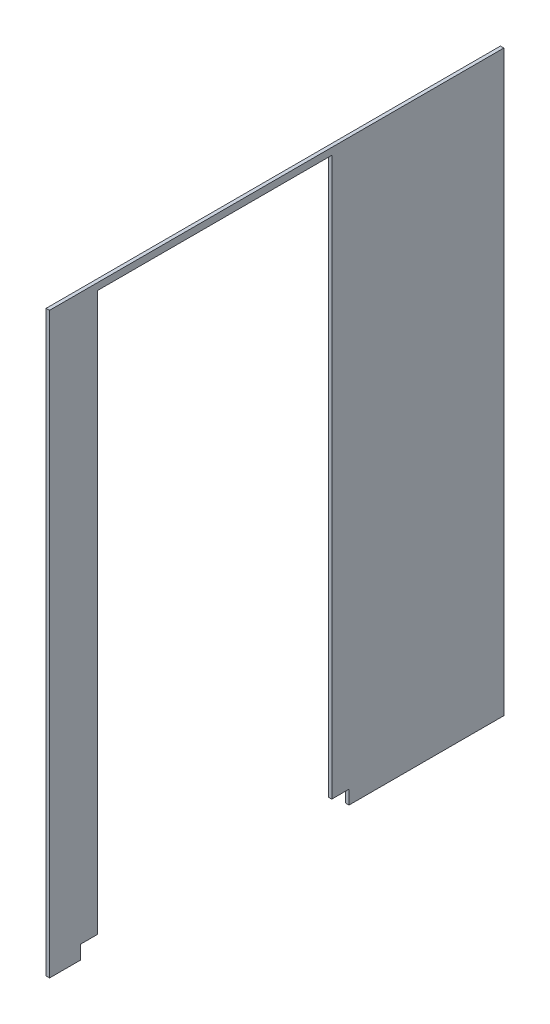
ISO-10303-21;
HEADER;
FILE_DESCRIPTION(('STEP AP214'),'2;1');
FILE_NAME('part.step','',(''),(''),'','','');
FILE_SCHEMA(('AUTOMOTIVE_DESIGN { 1 0 10303 214 1 1 1 1 }'));
ENDSEC;
DATA;
#1=APPLICATION_CONTEXT('core data for automotive mechanical design processes');
#2=APPLICATION_PROTOCOL_DEFINITION('international standard','automotive_design',2000,#1);
#3=PRODUCT_CONTEXT('',#1,'mechanical');
#4=PRODUCT('Part','Part','',(#3));
#5=PRODUCT_RELATED_PRODUCT_CATEGORY('part','',(#4));
#6=PRODUCT_DEFINITION_FORMATION('','',#4);
#7=PRODUCT_DEFINITION_CONTEXT('part definition',#1,'design');
#8=PRODUCT_DEFINITION('design','',#6,#7);
#9=PRODUCT_DEFINITION_SHAPE('','',#8);
#10=(LENGTH_UNIT() NAMED_UNIT(*) SI_UNIT(.MILLI.,.METRE.));
#11=(NAMED_UNIT(*) PLANE_ANGLE_UNIT() SI_UNIT($,.RADIAN.));
#12=(NAMED_UNIT(*) SI_UNIT($,.STERADIAN.) SOLID_ANGLE_UNIT());
#13=UNCERTAINTY_MEASURE_WITH_UNIT(LENGTH_MEASURE(1.E-05),#10,'distance_accuracy_value','');
#14=(GEOMETRIC_REPRESENTATION_CONTEXT(3) GLOBAL_UNCERTAINTY_ASSIGNED_CONTEXT((#13)) GLOBAL_UNIT_ASSIGNED_CONTEXT((#10,
#11,#12)) REPRESENTATION_CONTEXT('',''));
#15=CARTESIAN_POINT('',(0.,0.,0.));
#16=DIRECTION('',(0.,0.,1.));
#17=DIRECTION('',(1.,0.,0.));
#18=AXIS2_PLACEMENT_3D('',#15,#16,#17);
#19=CARTESIAN_POINT('',(12.7,0.,0.));
#20=DIRECTION('',(0.,0.,-1.));
#21=DIRECTION('',(-1.,0.,0.));
#22=AXIS2_PLACEMENT_3D('',#19,#20,#21);
#23=PLANE('',#22);
#24=DIRECTION('',(0.,-1.,0.));
#25=VECTOR('',#24,1.);
#26=CARTESIAN_POINT('',(0.,0.,0.));
#27=LINE('',#26,#25);
#28=CARTESIAN_POINT('',(0.,2133.6,0.));
#29=VERTEX_POINT('',#28);
#30=CARTESIAN_POINT('',(0.,0.,0.));
#31=VERTEX_POINT('',#30);
#32=EDGE_CURVE('E157',#29,#31,#27,.T.);
#33=ORIENTED_EDGE('',*,*,#32,.T.);
#34=DIRECTION('',(-1.,0.,0.));
#35=VECTOR('',#34,1.);
#36=CARTESIAN_POINT('',(12.7,0.,0.));
#37=LINE('',#36,#35);
#38=CARTESIAN_POINT('',(12.7,0.,0.));
#39=VERTEX_POINT('',#38);
#40=EDGE_CURVE('E11',#39,#31,#37,.T.);
#41=ORIENTED_EDGE('',*,*,#40,.F.);
#42=DIRECTION('',(0.,-1.,0.));
#43=VECTOR('',#42,1.);
#44=CARTESIAN_POINT('',(12.7,0.,0.));
#45=LINE('',#44,#43);
#46=CARTESIAN_POINT('',(12.7,2133.6,0.));
#47=VERTEX_POINT('',#46);
#48=EDGE_CURVE('E179',#47,#39,#45,.T.);
#49=ORIENTED_EDGE('',*,*,#48,.F.);
#50=DIRECTION('',(-1.,0.,0.));
#51=VECTOR('',#50,1.);
#52=CARTESIAN_POINT('',(12.7,2133.6,0.));
#53=LINE('',#52,#51);
#54=EDGE_CURVE('E153',#47,#29,#53,.T.);
#55=ORIENTED_EDGE('',*,*,#54,.T.);
#56=EDGE_LOOP('',(#33,#41,#49,#55));
#57=FACE_BOUND('',#56,.T.);
#58=ADVANCED_FACE('F37',(#57),#23,.F.);
#59=CARTESIAN_POINT('',(12.7,0.,0.));
#60=DIRECTION('',(0.,1.,0.));
#61=DIRECTION('',(0.,0.,1.));
#62=AXIS2_PLACEMENT_3D('',#59,#60,#61);
#63=PLANE('',#62);
#64=DIRECTION('',(0.,0.,-1.));
#65=VECTOR('',#64,1.);
#66=CARTESIAN_POINT('',(0.,0.,0.));
#67=LINE('',#66,#65);
#68=CARTESIAN_POINT('',(0.,0.,-114.3));
#69=VERTEX_POINT('',#68);
#70=EDGE_CURVE('E160',#31,#69,#67,.T.);
#71=ORIENTED_EDGE('',*,*,#70,.T.);
#72=DIRECTION('',(-1.,0.,0.));
#73=VECTOR('',#72,1.);
#74=CARTESIAN_POINT('',(12.7,0.,-114.3));
#75=LINE('',#74,#73);
#76=CARTESIAN_POINT('',(12.7,0.,-114.3));
#77=VERTEX_POINT('',#76);
#78=EDGE_CURVE('E45',#77,#69,#75,.T.);
#79=ORIENTED_EDGE('',*,*,#78,.F.);
#80=DIRECTION('',(0.,0.,-1.));
#81=VECTOR('',#80,1.);
#82=CARTESIAN_POINT('',(12.7,0.,0.));
#83=LINE('',#82,#81);
#84=EDGE_CURVE('E108',#39,#77,#83,.T.);
#85=ORIENTED_EDGE('',*,*,#84,.F.);
#86=ORIENTED_EDGE('',*,*,#40,.T.);
#87=EDGE_LOOP('',(#71,#79,#85,#86));
#88=FACE_BOUND('',#87,.T.);
#89=ADVANCED_FACE('F257',(#88),#63,.F.);
#90=CARTESIAN_POINT('',(12.7,0.,-114.3));
#91=DIRECTION('',(0.,0.,1.));
#92=DIRECTION('',(1.,0.,0.));
#93=AXIS2_PLACEMENT_3D('',#90,#91,#92);
#94=PLANE('',#93);
#95=DIRECTION('',(0.,1.,0.));
#96=VECTOR('',#95,1.);
#97=CARTESIAN_POINT('',(0.,0.,-114.3));
#98=LINE('',#97,#96);
#99=CARTESIAN_POINT('',(0.,50.8,-114.3));
#100=VERTEX_POINT('',#99);
#101=EDGE_CURVE('E162',#69,#100,#98,.T.);
#102=ORIENTED_EDGE('',*,*,#101,.T.);
#103=DIRECTION('',(-1.,0.,0.));
#104=VECTOR('',#103,1.);
#105=CARTESIAN_POINT('',(12.7,50.8,-114.3));
#106=LINE('',#105,#104);
#107=CARTESIAN_POINT('',(12.7,50.8,-114.3));
#108=VERTEX_POINT('',#107);
#109=EDGE_CURVE('E198',#108,#100,#106,.T.);
#110=ORIENTED_EDGE('',*,*,#109,.F.);
#111=DIRECTION('',(0.,1.,0.));
#112=VECTOR('',#111,1.);
#113=CARTESIAN_POINT('',(12.7,0.,-114.3));
#114=LINE('',#113,#112);
#115=EDGE_CURVE('E206',#77,#108,#114,.T.);
#116=ORIENTED_EDGE('',*,*,#115,.F.);
#117=ORIENTED_EDGE('',*,*,#78,.T.);
#118=EDGE_LOOP('',(#102,#110,#116,#117));
#119=FACE_BOUND('',#118,.T.);
#120=ADVANCED_FACE('F204',(#119),#94,.F.);
#121=CARTESIAN_POINT('',(12.7,50.8,-114.3));
#122=DIRECTION('',(0.,1.,0.));
#123=DIRECTION('',(0.,0.,1.));
#124=AXIS2_PLACEMENT_3D('',#121,#122,#123);
#125=PLANE('',#124);
#126=DIRECTION('',(0.,0.,-1.));
#127=VECTOR('',#126,1.);
#128=CARTESIAN_POINT('',(0.,50.8,-114.3));
#129=LINE('',#128,#127);
#130=CARTESIAN_POINT('',(0.,50.8,-177.8));
#131=VERTEX_POINT('',#130);
#132=EDGE_CURVE('E164',#100,#131,#129,.T.);
#133=ORIENTED_EDGE('',*,*,#132,.T.);
#134=DIRECTION('',(-1.,0.,0.));
#135=VECTOR('',#134,1.);
#136=CARTESIAN_POINT('',(12.7,50.8,-177.8));
#137=LINE('',#136,#135);
#138=CARTESIAN_POINT('',(12.7,50.8,-177.8));
#139=VERTEX_POINT('',#138);
#140=EDGE_CURVE('E195',#139,#131,#137,.T.);
#141=ORIENTED_EDGE('',*,*,#140,.F.);
#142=DIRECTION('',(0.,0.,-1.));
#143=VECTOR('',#142,1.);
#144=CARTESIAN_POINT('',(12.7,50.8,-114.3));
#145=LINE('',#144,#143);
#146=EDGE_CURVE('E224',#108,#139,#145,.T.);
#147=ORIENTED_EDGE('',*,*,#146,.F.);
#148=ORIENTED_EDGE('',*,*,#109,.T.);
#149=EDGE_LOOP('',(#133,#141,#147,#148));
#150=FACE_BOUND('',#149,.T.);
#151=ADVANCED_FACE('F215',(#150),#125,.F.);
#152=CARTESIAN_POINT('',(12.7,50.8,-177.8));
#153=DIRECTION('',(0.,0.,1.));
#154=DIRECTION('',(1.,0.,0.));
#155=AXIS2_PLACEMENT_3D('',#152,#153,#154);
#156=PLANE('',#155);
#157=DIRECTION('',(0.,1.,0.));
#158=VECTOR('',#157,1.);
#159=CARTESIAN_POINT('',(0.,50.8,-177.8));
#160=LINE('',#159,#158);
#161=CARTESIAN_POINT('',(0.,2108.2,-177.8));
#162=VERTEX_POINT('',#161);
#163=EDGE_CURVE('E166',#131,#162,#160,.T.);
#164=ORIENTED_EDGE('',*,*,#163,.T.);
#165=DIRECTION('',(-1.,0.,0.));
#166=VECTOR('',#165,1.);
#167=CARTESIAN_POINT('',(12.7,2108.2,-177.8));
#168=LINE('',#167,#166);
#169=CARTESIAN_POINT('',(12.7,2108.2,-177.8));
#170=VERTEX_POINT('',#169);
#171=EDGE_CURVE('E192',#170,#162,#168,.T.);
#172=ORIENTED_EDGE('',*,*,#171,.F.);
#173=DIRECTION('',(0.,1.,0.));
#174=VECTOR('',#173,1.);
#175=CARTESIAN_POINT('',(12.7,50.8,-177.8));
#176=LINE('',#175,#174);
#177=EDGE_CURVE('E221',#139,#170,#176,.T.);
#178=ORIENTED_EDGE('',*,*,#177,.F.);
#179=ORIENTED_EDGE('',*,*,#140,.T.);
#180=EDGE_LOOP('',(#164,#172,#178,#179));
#181=FACE_BOUND('',#180,.T.);
#182=ADVANCED_FACE('F219',(#181),#156,.F.);
#183=CARTESIAN_POINT('',(12.7,2108.2,-177.8));
#184=DIRECTION('',(0.,1.,0.));
#185=DIRECTION('',(0.,0.,1.));
#186=AXIS2_PLACEMENT_3D('',#183,#184,#185);
#187=PLANE('',#186);
#188=DIRECTION('',(0.,0.,-1.));
#189=VECTOR('',#188,1.);
#190=CARTESIAN_POINT('',(0.,2108.2,-177.8));
#191=LINE('',#190,#189);
#192=CARTESIAN_POINT('',(0.,2108.2,-1041.4));
#193=VERTEX_POINT('',#192);
#194=EDGE_CURVE('E168',#162,#193,#191,.T.);
#195=ORIENTED_EDGE('',*,*,#194,.T.);
#196=DIRECTION('',(-1.,0.,0.));
#197=VECTOR('',#196,1.);
#198=CARTESIAN_POINT('',(12.7,2108.2,-1041.4));
#199=LINE('',#198,#197);
#200=CARTESIAN_POINT('',(12.7,2108.2,-1041.4));
#201=VERTEX_POINT('',#200);
#202=EDGE_CURVE('E189',#201,#193,#199,.T.);
#203=ORIENTED_EDGE('',*,*,#202,.F.);
#204=DIRECTION('',(0.,0.,-1.));
#205=VECTOR('',#204,1.);
#206=CARTESIAN_POINT('',(12.7,2108.2,-177.8));
#207=LINE('',#206,#205);
#208=EDGE_CURVE('E223',#170,#201,#207,.T.);
#209=ORIENTED_EDGE('',*,*,#208,.F.);
#210=ORIENTED_EDGE('',*,*,#171,.T.);
#211=EDGE_LOOP('',(#195,#203,#209,#210));
#212=FACE_BOUND('',#211,.T.);
#213=ADVANCED_FACE('F270',(#212),#187,.F.);
#214=CARTESIAN_POINT('',(12.7,2108.2,-1041.4));
#215=DIRECTION('',(0.,0.,-1.));
#216=DIRECTION('',(0.,1.,0.));
#217=AXIS2_PLACEMENT_3D('',#214,#215,#216);
#218=PLANE('',#217);
#219=DIRECTION('',(0.,-1.,0.));
#220=VECTOR('',#219,1.);
#221=CARTESIAN_POINT('',(0.,2108.2,-1041.4));
#222=LINE('',#221,#220);
#223=CARTESIAN_POINT('',(0.,50.8000000000002,-1041.4));
#224=VERTEX_POINT('',#223);
#225=EDGE_CURVE('E170',#193,#224,#222,.T.);
#226=ORIENTED_EDGE('',*,*,#225,.T.);
#227=DIRECTION('',(-1.,0.,0.));
#228=VECTOR('',#227,1.);
#229=CARTESIAN_POINT('',(12.7,50.8000000000002,-1041.4));
#230=LINE('',#229,#228);
#231=CARTESIAN_POINT('',(12.7,50.8000000000002,-1041.4));
#232=VERTEX_POINT('',#231);
#233=EDGE_CURVE('E186',#232,#224,#230,.T.);
#234=ORIENTED_EDGE('',*,*,#233,.F.);
#235=DIRECTION('',(0.,-1.,0.));
#236=VECTOR('',#235,1.);
#237=CARTESIAN_POINT('',(12.7,2108.2,-1041.4));
#238=LINE('',#237,#236);
#239=EDGE_CURVE('E226',#201,#232,#238,.T.);
#240=ORIENTED_EDGE('',*,*,#239,.F.);
#241=ORIENTED_EDGE('',*,*,#202,.T.);
#242=EDGE_LOOP('',(#226,#234,#240,#241));
#243=FACE_BOUND('',#242,.T.);
#244=ADVANCED_FACE('F273',(#243),#218,.F.);
#245=CARTESIAN_POINT('',(12.7,50.8000000000002,-1041.4));
#246=DIRECTION('',(0.,1.,0.));
#247=DIRECTION('',(0.,0.,1.));
#248=AXIS2_PLACEMENT_3D('',#245,#246,#247);
#249=PLANE('',#248);
#250=DIRECTION('',(0.,0.,-1.));
#251=VECTOR('',#250,1.);
#252=CARTESIAN_POINT('',(0.,50.8000000000002,-1041.4));
#253=LINE('',#252,#251);
#254=CARTESIAN_POINT('',(0.,50.8000000000002,-1104.9));
#255=VERTEX_POINT('',#254);
#256=EDGE_CURVE('E172',#224,#255,#253,.T.);
#257=ORIENTED_EDGE('',*,*,#256,.T.);
#258=DIRECTION('',(-1.,0.,0.));
#259=VECTOR('',#258,1.);
#260=CARTESIAN_POINT('',(12.7,50.8000000000002,-1104.9));
#261=LINE('',#260,#259);
#262=CARTESIAN_POINT('',(12.7,50.8000000000002,-1104.9));
#263=VERTEX_POINT('',#262);
#264=EDGE_CURVE('E183',#263,#255,#261,.T.);
#265=ORIENTED_EDGE('',*,*,#264,.F.);
#266=DIRECTION('',(0.,0.,-1.));
#267=VECTOR('',#266,1.);
#268=CARTESIAN_POINT('',(12.7,50.8000000000002,-1041.4));
#269=LINE('',#268,#267);
#270=EDGE_CURVE('E232',#232,#263,#269,.T.);
#271=ORIENTED_EDGE('',*,*,#270,.F.);
#272=ORIENTED_EDGE('',*,*,#233,.T.);
#273=EDGE_LOOP('',(#257,#265,#271,#272));
#274=FACE_BOUND('',#273,.T.);
#275=ADVANCED_FACE('F238',(#274),#249,.F.);
#276=CARTESIAN_POINT('',(12.7,50.8000000000002,-1104.9));
#277=DIRECTION('',(0.,0.,-1.));
#278=DIRECTION('',(0.,1.,0.));
#279=AXIS2_PLACEMENT_3D('',#276,#277,#278);
#280=PLANE('',#279);
#281=DIRECTION('',(0.,-1.,0.));
#282=VECTOR('',#281,1.);
#283=CARTESIAN_POINT('',(0.,50.8000000000002,-1104.9));
#284=LINE('',#283,#282);
#285=CARTESIAN_POINT('',(0.,0.,-1104.9));
#286=VERTEX_POINT('',#285);
#287=EDGE_CURVE('E174',#255,#286,#284,.T.);
#288=ORIENTED_EDGE('',*,*,#287,.T.);
#289=DIRECTION('',(-1.,0.,0.));
#290=VECTOR('',#289,1.);
#291=CARTESIAN_POINT('',(12.7,0.,-1104.9));
#292=LINE('',#291,#290);
#293=CARTESIAN_POINT('',(12.7,0.,-1104.9));
#294=VERTEX_POINT('',#293);
#295=EDGE_CURVE('E148',#294,#286,#292,.T.);
#296=ORIENTED_EDGE('',*,*,#295,.F.);
#297=DIRECTION('',(0.,-1.,0.));
#298=VECTOR('',#297,1.);
#299=CARTESIAN_POINT('',(12.7,50.8000000000002,-1104.9));
#300=LINE('',#299,#298);
#301=EDGE_CURVE('E139',#263,#294,#300,.T.);
#302=ORIENTED_EDGE('',*,*,#301,.F.);
#303=ORIENTED_EDGE('',*,*,#264,.T.);
#304=EDGE_LOOP('',(#288,#296,#302,#303));
#305=FACE_BOUND('',#304,.T.);
#306=ADVANCED_FACE('F242',(#305),#280,.F.);
#307=CARTESIAN_POINT('',(12.7,0.,-1104.9));
#308=DIRECTION('',(0.,1.,0.));
#309=DIRECTION('',(0.,0.,1.));
#310=AXIS2_PLACEMENT_3D('',#307,#308,#309);
#311=PLANE('',#310);
#312=DIRECTION('',(0.,0.,-1.));
#313=VECTOR('',#312,1.);
#314=CARTESIAN_POINT('',(0.,0.,-1104.9));
#315=LINE('',#314,#313);
#316=CARTESIAN_POINT('',(0.,0.,-1676.4));
#317=VERTEX_POINT('',#316);
#318=EDGE_CURVE('E147',#286,#317,#315,.T.);
#319=ORIENTED_EDGE('',*,*,#318,.T.);
#320=DIRECTION('',(-1.,0.,0.));
#321=VECTOR('',#320,1.);
#322=CARTESIAN_POINT('',(12.7,0.,-1676.4));
#323=LINE('',#322,#321);
#324=CARTESIAN_POINT('',(12.7,0.,-1676.4));
#325=VERTEX_POINT('',#324);
#326=EDGE_CURVE('E144',#325,#317,#323,.T.);
#327=ORIENTED_EDGE('',*,*,#326,.F.);
#328=DIRECTION('',(0.,0.,-1.));
#329=VECTOR('',#328,1.);
#330=CARTESIAN_POINT('',(12.7,0.,-1104.9));
#331=LINE('',#330,#329);
#332=EDGE_CURVE('E133',#294,#325,#331,.T.);
#333=ORIENTED_EDGE('',*,*,#332,.F.);
#334=ORIENTED_EDGE('',*,*,#295,.T.);
#335=EDGE_LOOP('',(#319,#327,#333,#334));
#336=FACE_BOUND('',#335,.T.);
#337=ADVANCED_FACE('F145',(#336),#311,.F.);
#338=CARTESIAN_POINT('',(12.7,0.,-1676.4));
#339=DIRECTION('',(0.,0.,1.));
#340=DIRECTION('',(1.,0.,0.));
#341=AXIS2_PLACEMENT_3D('',#338,#339,#340);
#342=PLANE('',#341);
#343=DIRECTION('',(0.,1.,0.));
#344=VECTOR('',#343,1.);
#345=CARTESIAN_POINT('',(0.,0.,-1676.4));
#346=LINE('',#345,#344);
#347=CARTESIAN_POINT('',(0.,2133.6,-1676.4));
#348=VERTEX_POINT('',#347);
#349=EDGE_CURVE('E94',#317,#348,#346,.T.);
#350=ORIENTED_EDGE('',*,*,#349,.T.);
#351=DIRECTION('',(-1.,0.,0.));
#352=VECTOR('',#351,1.);
#353=CARTESIAN_POINT('',(12.7,2133.6,-1676.4));
#354=LINE('',#353,#352);
#355=CARTESIAN_POINT('',(12.7,2133.6,-1676.4));
#356=VERTEX_POINT('',#355);
#357=EDGE_CURVE('E149',#356,#348,#354,.T.);
#358=ORIENTED_EDGE('',*,*,#357,.F.);
#359=DIRECTION('',(0.,1.,0.));
#360=VECTOR('',#359,1.);
#361=CARTESIAN_POINT('',(12.7,0.,-1676.4));
#362=LINE('',#361,#360);
#363=EDGE_CURVE('E137',#325,#356,#362,.T.);
#364=ORIENTED_EDGE('',*,*,#363,.F.);
#365=ORIENTED_EDGE('',*,*,#326,.T.);
#366=EDGE_LOOP('',(#350,#358,#364,#365));
#367=FACE_BOUND('',#366,.T.);
#368=ADVANCED_FACE('F151',(#367),#342,.F.);
#369=CARTESIAN_POINT('',(12.7,2133.6,0.));
#370=DIRECTION('',(0.,-1.,0.));
#371=DIRECTION('',(0.,0.,-1.));
#372=AXIS2_PLACEMENT_3D('',#369,#370,#371);
#373=PLANE('',#372);
#374=DIRECTION('',(0.,0.,1.));
#375=VECTOR('',#374,1.);
#376=CARTESIAN_POINT('',(0.,2133.6,0.));
#377=LINE('',#376,#375);
#378=EDGE_CURVE('E100',#348,#29,#377,.T.);
#379=ORIENTED_EDGE('',*,*,#378,.T.);
#380=ORIENTED_EDGE('',*,*,#54,.F.);
#381=DIRECTION('',(0.,0.,1.));
#382=VECTOR('',#381,1.);
#383=CARTESIAN_POINT('',(12.7,2133.6,0.));
#384=LINE('',#383,#382);
#385=EDGE_CURVE('E53',#356,#47,#384,.T.);
#386=ORIENTED_EDGE('',*,*,#385,.F.);
#387=ORIENTED_EDGE('',*,*,#357,.T.);
#388=EDGE_LOOP('',(#379,#380,#386,#387));
#389=FACE_BOUND('',#388,.T.);
#390=ADVANCED_FACE('F246',(#389),#373,.F.);
#391=CARTESIAN_POINT('',(12.7,0.,0.));
#392=DIRECTION('',(-1.,0.,0.));
#393=DIRECTION('',(0.,0.,1.));
#394=AXIS2_PLACEMENT_3D('',#391,#392,#393);
#395=PLANE('',#394);
#396=ORIENTED_EDGE('',*,*,#48,.T.);
#397=ORIENTED_EDGE('',*,*,#84,.T.);
#398=ORIENTED_EDGE('',*,*,#115,.T.);
#399=ORIENTED_EDGE('',*,*,#146,.T.);
#400=ORIENTED_EDGE('',*,*,#177,.T.);
#401=ORIENTED_EDGE('',*,*,#208,.T.);
#402=ORIENTED_EDGE('',*,*,#239,.T.);
#403=ORIENTED_EDGE('',*,*,#270,.T.);
#404=ORIENTED_EDGE('',*,*,#301,.T.);
#405=ORIENTED_EDGE('',*,*,#332,.T.);
#406=ORIENTED_EDGE('',*,*,#363,.T.);
#407=ORIENTED_EDGE('',*,*,#385,.T.);
#408=EDGE_LOOP('',(#396,#397,#398,#399,#400,#401,#402,#403,#404,#405,#406,#407));
#409=FACE_BOUND('',#408,.T.);
#410=ADVANCED_FACE('F135',(#409),#395,.F.);
#411=CARTESIAN_POINT('',(0.,0.,0.));
#412=DIRECTION('',(-1.,0.,0.));
#413=DIRECTION('',(0.,0.,1.));
#414=AXIS2_PLACEMENT_3D('',#411,#412,#413);
#415=PLANE('',#414);
#416=ORIENTED_EDGE('',*,*,#32,.F.);
#417=ORIENTED_EDGE('',*,*,#378,.F.);
#418=ORIENTED_EDGE('',*,*,#349,.F.);
#419=ORIENTED_EDGE('',*,*,#318,.F.);
#420=ORIENTED_EDGE('',*,*,#287,.F.);
#421=ORIENTED_EDGE('',*,*,#256,.F.);
#422=ORIENTED_EDGE('',*,*,#225,.F.);
#423=ORIENTED_EDGE('',*,*,#194,.F.);
#424=ORIENTED_EDGE('',*,*,#163,.F.);
#425=ORIENTED_EDGE('',*,*,#132,.F.);
#426=ORIENTED_EDGE('',*,*,#101,.F.);
#427=ORIENTED_EDGE('',*,*,#70,.F.);
#428=EDGE_LOOP('',(#416,#417,#418,#419,#420,#421,#422,#423,#424,#425,#426,#427));
#429=FACE_BOUND('',#428,.T.);
#430=ADVANCED_FACE('F210',(#429),#415,.T.);
#431=CLOSED_SHELL('',(#58,#89,#120,#151,#182,#213,#244,#275,#306,#337,#368,#390,#410,#430));
#432=MANIFOLD_SOLID_BREP('B2',#431);
#433=ADVANCED_BREP_SHAPE_REPRESENTATION('',(#18,#432),#14);
#434=SHAPE_DEFINITION_REPRESENTATION(#9,#433);
ENDSEC;
END-ISO-10303-21;
